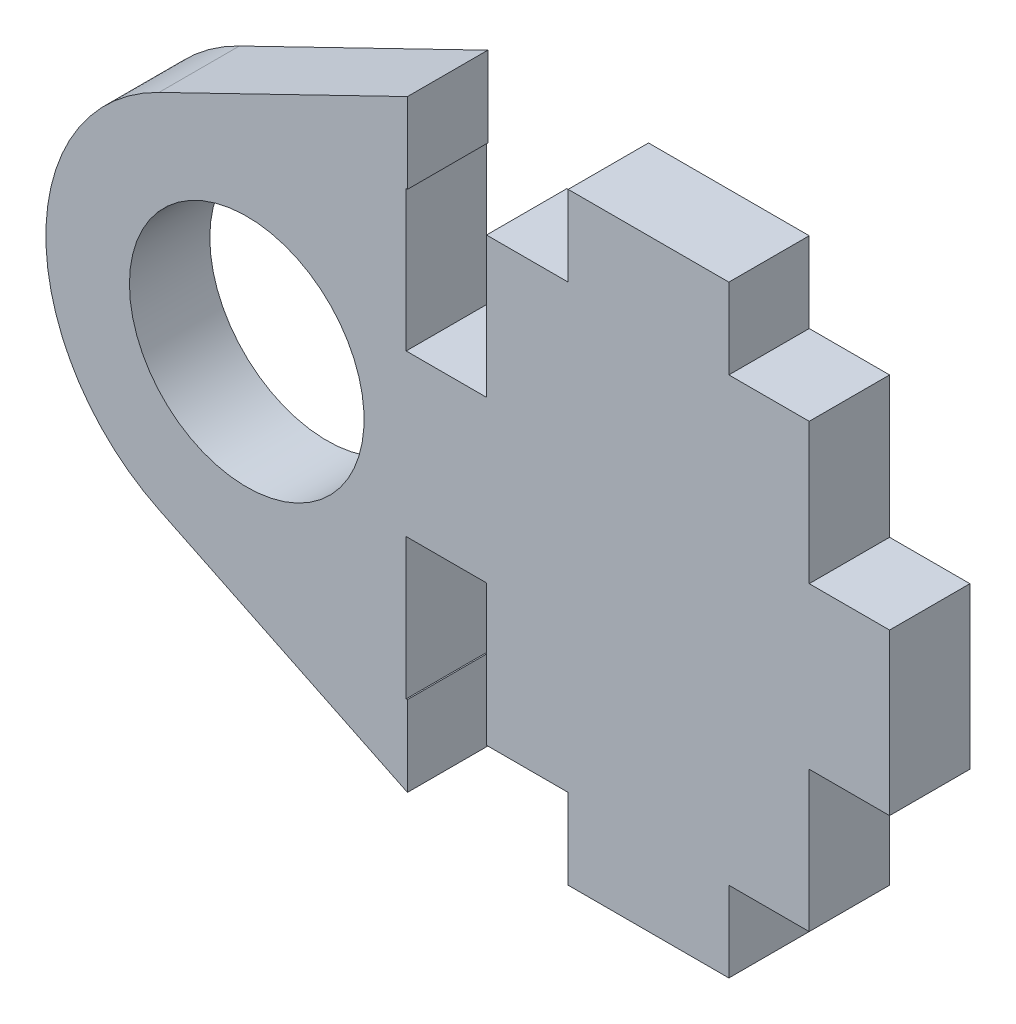
ISO-10303-21;
HEADER;
FILE_DESCRIPTION(('STEP AP214'),'2;1');
FILE_NAME('part.step','',(''),(''),'','','');
FILE_SCHEMA(('AUTOMOTIVE_DESIGN { 1 0 10303 214 1 1 1 1 }'));
ENDSEC;
DATA;
#1=APPLICATION_CONTEXT('core data for automotive mechanical design processes');
#2=APPLICATION_PROTOCOL_DEFINITION('international standard','automotive_design',2000,#1);
#3=PRODUCT_CONTEXT('',#1,'mechanical');
#4=PRODUCT('Part','Part','',(#3));
#5=PRODUCT_RELATED_PRODUCT_CATEGORY('part','',(#4));
#6=PRODUCT_DEFINITION_FORMATION('','',#4);
#7=PRODUCT_DEFINITION_CONTEXT('part definition',#1,'design');
#8=PRODUCT_DEFINITION('design','',#6,#7);
#9=PRODUCT_DEFINITION_SHAPE('','',#8);
#10=(LENGTH_UNIT() NAMED_UNIT(*) SI_UNIT(.MILLI.,.METRE.));
#11=(NAMED_UNIT(*) PLANE_ANGLE_UNIT() SI_UNIT($,.RADIAN.));
#12=(NAMED_UNIT(*) SI_UNIT($,.STERADIAN.) SOLID_ANGLE_UNIT());
#13=UNCERTAINTY_MEASURE_WITH_UNIT(LENGTH_MEASURE(1.E-05),#10,'distance_accuracy_value','');
#14=(GEOMETRIC_REPRESENTATION_CONTEXT(3) GLOBAL_UNCERTAINTY_ASSIGNED_CONTEXT((#13)) GLOBAL_UNIT_ASSIGNED_CONTEXT((#10,
#11,#12)) REPRESENTATION_CONTEXT('',''));
#15=CARTESIAN_POINT('',(0.,0.,0.));
#16=DIRECTION('',(0.,0.,1.));
#17=DIRECTION('',(1.,0.,0.));
#18=AXIS2_PLACEMENT_3D('',#15,#16,#17);
#19=CARTESIAN_POINT('',(-31.75,0.,6.35));
#20=DIRECTION('',(0.,0.,1.));
#21=DIRECTION('',(1.,0.,0.));
#22=AXIS2_PLACEMENT_3D('',#19,#20,#21);
#23=PLANE('',#22);
#24=CARTESIAN_POINT('',(-31.75,0.,6.35));
#25=DIRECTION('',(0.,0.,-1.));
#26=DIRECTION('',(-1.,0.,0.));
#27=AXIS2_PLACEMENT_3D('',#24,#25,#26);
#28=CIRCLE('',#27,9.271);
#29=CARTESIAN_POINT('',(-41.021,0.,6.35));
#30=VERTEX_POINT('',#29);
#31=EDGE_CURVE('E243',#30,#30,#28,.T.);
#32=ORIENTED_EDGE('',*,*,#31,.T.);
#33=EDGE_LOOP('',(#32));
#34=FACE_BOUND('',#33,.T.);
#35=DIRECTION('',(1.,0.,0.));
#36=VECTOR('',#35,1.);
#37=CARTESIAN_POINT('',(6.35000000000001,-17.4625,6.35));
#38=LINE('',#37,#36);
#39=CARTESIAN_POINT('',(6.35000000000001,-17.4625,6.35));
#40=VERTEX_POINT('',#39);
#41=CARTESIAN_POINT('',(12.7,-17.4625,6.35));
#42=VERTEX_POINT('',#41);
#43=EDGE_CURVE('E379',#40,#42,#38,.T.);
#44=ORIENTED_EDGE('',*,*,#43,.T.);
#45=DIRECTION('',(0.,1.,0.));
#46=VECTOR('',#45,1.);
#47=CARTESIAN_POINT('',(12.7,-17.4625,6.35000000000005));
#48=LINE('',#47,#46);
#49=CARTESIAN_POINT('',(12.7,-6.35000000000003,6.35000000000005));
#50=VERTEX_POINT('',#49);
#51=EDGE_CURVE('E56',#42,#50,#48,.T.);
#52=ORIENTED_EDGE('',*,*,#51,.T.);
#53=DIRECTION('',(-1.,0.,0.));
#54=VECTOR('',#53,1.);
#55=CARTESIAN_POINT('',(12.7,-6.35000000000003,6.35000000000005));
#56=LINE('',#55,#54);
#57=CARTESIAN_POINT('',(19.05,-6.35000000000003,6.35000000000005));
#58=VERTEX_POINT('',#57);
#59=EDGE_CURVE('E435',#58,#50,#56,.T.);
#60=ORIENTED_EDGE('',*,*,#59,.F.);
#61=DIRECTION('',(0.,1.,0.));
#62=VECTOR('',#61,1.);
#63=CARTESIAN_POINT('',(19.05,-23.8125,6.35));
#64=LINE('',#63,#62);
#65=CARTESIAN_POINT('',(19.05,6.34999999999997,6.35000000000005));
#66=VERTEX_POINT('',#65);
#67=EDGE_CURVE('E236',#58,#66,#64,.T.);
#68=ORIENTED_EDGE('',*,*,#67,.T.);
#69=DIRECTION('',(1.,0.,0.));
#70=VECTOR('',#69,1.);
#71=CARTESIAN_POINT('',(12.7,6.34999999999997,6.35000000000005));
#72=LINE('',#71,#70);
#73=CARTESIAN_POINT('',(12.7,6.34999999999997,6.35000000000005));
#74=VERTEX_POINT('',#73);
#75=EDGE_CURVE('E227',#74,#66,#72,.T.);
#76=ORIENTED_EDGE('',*,*,#75,.F.);
#77=CARTESIAN_POINT('',(12.7,17.4625,6.35000000000005));
#78=VERTEX_POINT('',#77);
#79=EDGE_CURVE('E437',#74,#78,#48,.T.);
#80=ORIENTED_EDGE('',*,*,#79,.T.);
#81=DIRECTION('',(-1.,0.,0.));
#82=VECTOR('',#81,1.);
#83=CARTESIAN_POINT('',(6.35000000000001,17.4625,6.35));
#84=LINE('',#83,#82);
#85=CARTESIAN_POINT('',(6.35000000000001,17.4625,6.35));
#86=VERTEX_POINT('',#85);
#87=EDGE_CURVE('E391',#78,#86,#84,.T.);
#88=ORIENTED_EDGE('',*,*,#87,.T.);
#89=DIRECTION('',(0.,1.,0.));
#90=VECTOR('',#89,1.);
#91=CARTESIAN_POINT('',(6.35000000000001,17.4625,6.35));
#92=LINE('',#91,#90);
#93=CARTESIAN_POINT('',(6.35000000000001,23.8125,6.35));
#94=VERTEX_POINT('',#93);
#95=EDGE_CURVE('E393',#86,#94,#92,.T.);
#96=ORIENTED_EDGE('',*,*,#95,.T.);
#97=DIRECTION('',(-1.,0.,0.));
#98=VECTOR('',#97,1.);
#99=CARTESIAN_POINT('',(-19.05,23.8125,6.35));
#100=LINE('',#99,#98);
#101=CARTESIAN_POINT('',(-6.34999999999998,23.8125,6.35));
#102=VERTEX_POINT('',#101);
#103=EDGE_CURVE('E408',#94,#102,#100,.T.);
#104=ORIENTED_EDGE('',*,*,#103,.T.);
#105=DIRECTION('',(0.,-1.,0.));
#106=VECTOR('',#105,1.);
#107=CARTESIAN_POINT('',(-6.34999999999998,17.4625,6.35));
#108=LINE('',#107,#106);
#109=CARTESIAN_POINT('',(-6.34999999999998,17.4625,6.35));
#110=VERTEX_POINT('',#109);
#111=EDGE_CURVE('E356',#102,#110,#108,.T.);
#112=ORIENTED_EDGE('',*,*,#111,.T.);
#113=DIRECTION('',(-1.,0.,0.));
#114=VECTOR('',#113,1.);
#115=CARTESIAN_POINT('',(-19.05,17.4625,6.35));
#116=LINE('',#115,#114);
#117=CARTESIAN_POINT('',(-12.8016,17.4625,6.35));
#118=VERTEX_POINT('',#117);
#119=EDGE_CURVE('E359',#110,#118,#116,.T.);
#120=ORIENTED_EDGE('',*,*,#119,.T.);
#121=DIRECTION('',(0.,1.,0.));
#122=VECTOR('',#121,1.);
#123=CARTESIAN_POINT('',(-12.8016,-17.4625,6.34999999999999));
#124=LINE('',#123,#122);
#125=CARTESIAN_POINT('',(-12.8016,6.34999999999997,6.34999999999999));
#126=VERTEX_POINT('',#125);
#127=EDGE_CURVE('E308',#126,#118,#124,.T.);
#128=ORIENTED_EDGE('',*,*,#127,.F.);
#129=DIRECTION('',(1.,0.,0.));
#130=VECTOR('',#129,1.);
#131=CARTESIAN_POINT('',(-19.1516,6.34999999999997,6.34999999999999));
#132=LINE('',#131,#130);
#133=CARTESIAN_POINT('',(-19.1516,6.34999999999997,6.34999999999999));
#134=VERTEX_POINT('',#133);
#135=EDGE_CURVE('E458',#134,#126,#132,.T.);
#136=ORIENTED_EDGE('',*,*,#135,.F.);
#137=DIRECTION('',(0.,1.,0.));
#138=VECTOR('',#137,1.);
#139=CARTESIAN_POINT('',(-19.1516,-17.4625,6.34999999999999));
#140=LINE('',#139,#138);
#141=CARTESIAN_POINT('',(-19.1516,17.4625,6.34999999999999));
#142=VERTEX_POINT('',#141);
#143=EDGE_CURVE('E318',#134,#142,#140,.T.);
#144=ORIENTED_EDGE('',*,*,#143,.T.);
#145=DIRECTION('',(1.,0.,0.));
#146=VECTOR('',#145,1.);
#147=CARTESIAN_POINT('',(-19.1516,17.4625,6.34999999999999));
#148=LINE('',#147,#146);
#149=CARTESIAN_POINT('',(-19.05,17.4625,6.34999999999999));
#150=VERTEX_POINT('',#149);
#151=EDGE_CURVE('E300',#142,#150,#148,.T.);
#152=ORIENTED_EDGE('',*,*,#151,.T.);
#153=DIRECTION('',(0.,1.,0.));
#154=VECTOR('',#153,1.);
#155=CARTESIAN_POINT('',(-19.05,17.4625,6.35));
#156=LINE('',#155,#154);
#157=CARTESIAN_POINT('',(-19.05,23.8125,6.35));
#158=VERTEX_POINT('',#157);
#159=EDGE_CURVE('E362',#150,#158,#156,.T.);
#160=ORIENTED_EDGE('',*,*,#159,.T.);
#161=DIRECTION('',(-0.899591061172804,-0.436733239699006,0.));
#162=VECTOR('',#161,1.);
#163=CARTESIAN_POINT('',(-19.05,23.8125,6.35));
#164=LINE('',#163,#162);
#165=CARTESIAN_POINT('',(-38.6831401802217,14.2810080961183,6.35));
#166=VERTEX_POINT('',#165);
#167=EDGE_CURVE('E411',#158,#166,#164,.T.);
#168=ORIENTED_EDGE('',*,*,#167,.T.);
#169=CARTESIAN_POINT('',(-31.75,0.,6.35));
#170=DIRECTION('',(0.,0.,1.));
#171=DIRECTION('',(1.,0.,0.));
#172=AXIS2_PLACEMENT_3D('',#169,#170,#171);
#173=CIRCLE('',#172,15.875);
#174=CARTESIAN_POINT('',(-38.6831401802217,-14.2810080961183,6.35));
#175=VERTEX_POINT('',#174);
#176=EDGE_CURVE('E413',#166,#175,#173,.T.);
#177=ORIENTED_EDGE('',*,*,#176,.T.);
#178=DIRECTION('',(0.899591061172804,-0.436733239699006,0.));
#179=VECTOR('',#178,1.);
#180=CARTESIAN_POINT('',(-19.05,-23.8125,6.35));
#181=LINE('',#180,#179);
#182=CARTESIAN_POINT('',(-19.05,-23.8125,6.35));
#183=VERTEX_POINT('',#182);
#184=EDGE_CURVE('E414',#175,#183,#181,.T.);
#185=ORIENTED_EDGE('',*,*,#184,.T.);
#186=DIRECTION('',(0.,1.,0.));
#187=VECTOR('',#186,1.);
#188=CARTESIAN_POINT('',(-19.05,-30.1625,6.35));
#189=LINE('',#188,#187);
#190=CARTESIAN_POINT('',(-19.05,-17.4625,6.34999999999999));
#191=VERTEX_POINT('',#190);
#192=EDGE_CURVE('E338',#183,#191,#189,.T.);
#193=ORIENTED_EDGE('',*,*,#192,.T.);
#194=DIRECTION('',(1.,0.,0.));
#195=VECTOR('',#194,1.);
#196=CARTESIAN_POINT('',(-19.1516,-17.4625,6.34999999999999));
#197=LINE('',#196,#195);
#198=CARTESIAN_POINT('',(-19.1516,-17.4625,6.34999999999999));
#199=VERTEX_POINT('',#198);
#200=EDGE_CURVE('E320',#199,#191,#197,.T.);
#201=ORIENTED_EDGE('',*,*,#200,.F.);
#202=CARTESIAN_POINT('',(-19.1516,-6.35000000000003,6.34999999999999));
#203=VERTEX_POINT('',#202);
#204=EDGE_CURVE('E303',#199,#203,#140,.T.);
#205=ORIENTED_EDGE('',*,*,#204,.T.);
#206=DIRECTION('',(-1.,0.,0.));
#207=VECTOR('',#206,1.);
#208=CARTESIAN_POINT('',(-19.1516,-6.35000000000003,6.34999999999999));
#209=LINE('',#208,#207);
#210=CARTESIAN_POINT('',(-12.8016,-6.35000000000003,6.34999999999999));
#211=VERTEX_POINT('',#210);
#212=EDGE_CURVE('E313',#211,#203,#209,.T.);
#213=ORIENTED_EDGE('',*,*,#212,.F.);
#214=CARTESIAN_POINT('',(-12.8016,-17.4625,6.34999999999999));
#215=VERTEX_POINT('',#214);
#216=EDGE_CURVE('E311',#215,#211,#124,.T.);
#217=ORIENTED_EDGE('',*,*,#216,.F.);
#218=DIRECTION('',(1.,0.,0.));
#219=VECTOR('',#218,1.);
#220=CARTESIAN_POINT('',(-19.05,-17.4625,6.35));
#221=LINE('',#220,#219);
#222=CARTESIAN_POINT('',(-6.34999999999998,-17.4625,6.35));
#223=VERTEX_POINT('',#222);
#224=EDGE_CURVE('E342',#215,#223,#221,.T.);
#225=ORIENTED_EDGE('',*,*,#224,.T.);
#226=DIRECTION('',(0.,-1.,0.));
#227=VECTOR('',#226,1.);
#228=CARTESIAN_POINT('',(-6.34999999999998,-30.1625,6.35));
#229=LINE('',#228,#227);
#230=CARTESIAN_POINT('',(-6.34999999999998,-23.8125,6.35));
#231=VERTEX_POINT('',#230);
#232=EDGE_CURVE('E335',#223,#231,#229,.T.);
#233=ORIENTED_EDGE('',*,*,#232,.T.);
#234=DIRECTION('',(1.,0.,0.));
#235=VECTOR('',#234,1.);
#236=CARTESIAN_POINT('',(-19.05,-23.8125,6.35));
#237=LINE('',#236,#235);
#238=CARTESIAN_POINT('',(6.35000000000001,-23.8125,6.35));
#239=VERTEX_POINT('',#238);
#240=EDGE_CURVE('E252',#231,#239,#237,.T.);
#241=ORIENTED_EDGE('',*,*,#240,.T.);
#242=DIRECTION('',(0.,1.,0.));
#243=VECTOR('',#242,1.);
#244=CARTESIAN_POINT('',(6.35000000000001,-30.1625,6.35));
#245=LINE('',#244,#243);
#246=EDGE_CURVE('E376',#239,#40,#245,.T.);
#247=ORIENTED_EDGE('',*,*,#246,.T.);
#248=EDGE_LOOP('',(#44,#52,#60,#68,#76,#80,#88,#96,#104,#112,#120,#128,#136,#144,#152,#160,#168,
#177,#185,#193,#201,#205,#213,#217,#225,#233,#241,#247));
#249=FACE_BOUND('',#248,.T.);
#250=ADVANCED_FACE('F33',(#34,#249),#23,.T.);
#251=CARTESIAN_POINT('',(-31.75,0.,0.));
#252=DIRECTION('',(0.,0.,1.));
#253=DIRECTION('',(1.,0.,0.));
#254=AXIS2_PLACEMENT_3D('',#251,#252,#253);
#255=PLANE('',#254);
#256=DIRECTION('',(-1.,0.,0.));
#257=VECTOR('',#256,1.);
#258=CARTESIAN_POINT('',(19.05,-6.35000000000003,0.));
#259=LINE('',#258,#257);
#260=CARTESIAN_POINT('',(19.05,-6.35000000000003,0.));
#261=VERTEX_POINT('',#260);
#262=CARTESIAN_POINT('',(12.7,-6.35000000000003,0.));
#263=VERTEX_POINT('',#262);
#264=EDGE_CURVE('E217',#261,#263,#259,.T.);
#265=ORIENTED_EDGE('',*,*,#264,.T.);
#266=DIRECTION('',(0.,1.,0.));
#267=VECTOR('',#266,1.);
#268=CARTESIAN_POINT('',(12.7,0.,0.));
#269=LINE('',#268,#267);
#270=CARTESIAN_POINT('',(12.7,-17.4625,0.));
#271=VERTEX_POINT('',#270);
#272=EDGE_CURVE('E448',#271,#263,#269,.T.);
#273=ORIENTED_EDGE('',*,*,#272,.F.);
#274=DIRECTION('',(1.,0.,0.));
#275=VECTOR('',#274,1.);
#276=CARTESIAN_POINT('',(6.35000000000001,-17.4625,0.));
#277=LINE('',#276,#275);
#278=CARTESIAN_POINT('',(6.35000000000001,-17.4625,0.));
#279=VERTEX_POINT('',#278);
#280=EDGE_CURVE('E375',#279,#271,#277,.T.);
#281=ORIENTED_EDGE('',*,*,#280,.F.);
#282=DIRECTION('',(0.,-1.,0.));
#283=VECTOR('',#282,1.);
#284=CARTESIAN_POINT('',(6.35000000000002,0.,0.));
#285=LINE('',#284,#283);
#286=CARTESIAN_POINT('',(6.35,-23.8125,0.));
#287=VERTEX_POINT('',#286);
#288=EDGE_CURVE('E274',#279,#287,#285,.T.);
#289=ORIENTED_EDGE('',*,*,#288,.T.);
#290=DIRECTION('',(1.,0.,0.));
#291=VECTOR('',#290,1.);
#292=CARTESIAN_POINT('',(-19.05,-23.8125,0.));
#293=LINE('',#292,#291);
#294=CARTESIAN_POINT('',(-6.34999999999998,-23.8125,0.));
#295=VERTEX_POINT('',#294);
#296=EDGE_CURVE('E260',#295,#287,#293,.T.);
#297=ORIENTED_EDGE('',*,*,#296,.F.);
#298=DIRECTION('',(0.,-1.,0.));
#299=VECTOR('',#298,1.);
#300=CARTESIAN_POINT('',(-6.34999999999998,-30.1625,0.));
#301=LINE('',#300,#299);
#302=CARTESIAN_POINT('',(-6.34999999999998,-17.4625,0.));
#303=VERTEX_POINT('',#302);
#304=EDGE_CURVE('E345',#303,#295,#301,.T.);
#305=ORIENTED_EDGE('',*,*,#304,.F.);
#306=DIRECTION('',(1.,0.,0.));
#307=VECTOR('',#306,1.);
#308=CARTESIAN_POINT('',(-19.05,-17.4625,0.));
#309=LINE('',#308,#307);
#310=CARTESIAN_POINT('',(-12.8016,-17.4625,0.));
#311=VERTEX_POINT('',#310);
#312=EDGE_CURVE('E339',#311,#303,#309,.T.);
#313=ORIENTED_EDGE('',*,*,#312,.F.);
#314=DIRECTION('',(0.,1.,0.));
#315=VECTOR('',#314,1.);
#316=CARTESIAN_POINT('',(-12.8016,0.,0.));
#317=LINE('',#316,#315);
#318=CARTESIAN_POINT('',(-12.8016,-6.35000000000003,0.));
#319=VERTEX_POINT('',#318);
#320=EDGE_CURVE('E334',#311,#319,#317,.T.);
#321=ORIENTED_EDGE('',*,*,#320,.T.);
#322=DIRECTION('',(-1.,0.,0.));
#323=VECTOR('',#322,1.);
#324=CARTESIAN_POINT('',(-12.8016,-6.35000000000003,0.));
#325=LINE('',#324,#323);
#326=CARTESIAN_POINT('',(-19.1516,-6.35000000000003,0.));
#327=VERTEX_POINT('',#326);
#328=EDGE_CURVE('E455',#319,#327,#325,.T.);
#329=ORIENTED_EDGE('',*,*,#328,.T.);
#330=DIRECTION('',(0.,1.,0.));
#331=VECTOR('',#330,1.);
#332=CARTESIAN_POINT('',(-19.1516,0.,0.));
#333=LINE('',#332,#331);
#334=CARTESIAN_POINT('',(-19.1516,-17.4625,0.));
#335=VERTEX_POINT('',#334);
#336=EDGE_CURVE('E11',#335,#327,#333,.T.);
#337=ORIENTED_EDGE('',*,*,#336,.F.);
#338=DIRECTION('',(1.,0.,0.));
#339=VECTOR('',#338,1.);
#340=CARTESIAN_POINT('',(-19.1516,-17.4625,0.));
#341=LINE('',#340,#339);
#342=CARTESIAN_POINT('',(-19.05,-17.4625,0.));
#343=VERTEX_POINT('',#342);
#344=EDGE_CURVE('E309',#335,#343,#341,.T.);
#345=ORIENTED_EDGE('',*,*,#344,.T.);
#346=DIRECTION('',(0.,-1.,0.));
#347=VECTOR('',#346,1.);
#348=CARTESIAN_POINT('',(-19.05,0.,0.));
#349=LINE('',#348,#347);
#350=CARTESIAN_POINT('',(-19.05,-23.8125,0.));
#351=VERTEX_POINT('',#350);
#352=EDGE_CURVE('E279',#343,#351,#349,.T.);
#353=ORIENTED_EDGE('',*,*,#352,.T.);
#354=DIRECTION('',(0.899591061172804,-0.436733239699006,0.));
#355=VECTOR('',#354,1.);
#356=CARTESIAN_POINT('',(-19.05,-23.8125,0.));
#357=LINE('',#356,#355);
#358=CARTESIAN_POINT('',(-38.6831401802217,-14.2810080961183,0.));
#359=VERTEX_POINT('',#358);
#360=EDGE_CURVE('E258',#359,#351,#357,.T.);
#361=ORIENTED_EDGE('',*,*,#360,.F.);
#362=CARTESIAN_POINT('',(-31.75,0.,0.));
#363=DIRECTION('',(0.,0.,1.));
#364=DIRECTION('',(1.,0.,0.));
#365=AXIS2_PLACEMENT_3D('',#362,#363,#364);
#366=CIRCLE('',#365,15.875);
#367=CARTESIAN_POINT('',(-38.6831401802217,14.2810080961183,0.));
#368=VERTEX_POINT('',#367);
#369=EDGE_CURVE('E256',#368,#359,#366,.T.);
#370=ORIENTED_EDGE('',*,*,#369,.F.);
#371=DIRECTION('',(-0.899591061172804,-0.436733239699006,0.));
#372=VECTOR('',#371,1.);
#373=CARTESIAN_POINT('',(-19.05,23.8125,0.));
#374=LINE('',#373,#372);
#375=CARTESIAN_POINT('',(-19.05,23.8125,0.));
#376=VERTEX_POINT('',#375);
#377=EDGE_CURVE('E246',#376,#368,#374,.T.);
#378=ORIENTED_EDGE('',*,*,#377,.F.);
#379=DIRECTION('',(0.,1.,0.));
#380=VECTOR('',#379,1.);
#381=CARTESIAN_POINT('',(-19.05,17.4625,0.));
#382=LINE('',#381,#380);
#383=CARTESIAN_POINT('',(-19.05,17.4625,0.));
#384=VERTEX_POINT('',#383);
#385=EDGE_CURVE('E307',#384,#376,#382,.T.);
#386=ORIENTED_EDGE('',*,*,#385,.F.);
#387=DIRECTION('',(-1.,0.,0.));
#388=VECTOR('',#387,1.);
#389=CARTESIAN_POINT('',(-19.1516,17.4625,0.));
#390=LINE('',#389,#388);
#391=CARTESIAN_POINT('',(-19.1516,17.4625,0.));
#392=VERTEX_POINT('',#391);
#393=EDGE_CURVE('E297',#384,#392,#390,.T.);
#394=ORIENTED_EDGE('',*,*,#393,.T.);
#395=CARTESIAN_POINT('',(-19.1516,6.34999999999997,0.));
#396=VERTEX_POINT('',#395);
#397=EDGE_CURVE('E37',#396,#392,#333,.T.);
#398=ORIENTED_EDGE('',*,*,#397,.F.);
#399=DIRECTION('',(-1.,0.,0.));
#400=VECTOR('',#399,1.);
#401=CARTESIAN_POINT('',(-12.8016,6.34999999999997,0.));
#402=LINE('',#401,#400);
#403=CARTESIAN_POINT('',(-12.8016,6.34999999999997,0.));
#404=VERTEX_POINT('',#403);
#405=EDGE_CURVE('E451',#404,#396,#402,.T.);
#406=ORIENTED_EDGE('',*,*,#405,.F.);
#407=CARTESIAN_POINT('',(-12.8016,17.4625,0.));
#408=VERTEX_POINT('',#407);
#409=EDGE_CURVE('E331',#404,#408,#317,.T.);
#410=ORIENTED_EDGE('',*,*,#409,.T.);
#411=DIRECTION('',(-1.,0.,0.));
#412=VECTOR('',#411,1.);
#413=CARTESIAN_POINT('',(-19.05,17.4625,0.));
#414=LINE('',#413,#412);
#415=CARTESIAN_POINT('',(-6.34999999999999,17.4625,0.));
#416=VERTEX_POINT('',#415);
#417=EDGE_CURVE('E355',#416,#408,#414,.T.);
#418=ORIENTED_EDGE('',*,*,#417,.F.);
#419=DIRECTION('',(0.,1.,0.));
#420=VECTOR('',#419,1.);
#421=CARTESIAN_POINT('',(-6.34999999999999,0.,0.));
#422=LINE('',#421,#420);
#423=CARTESIAN_POINT('',(-6.34999999999998,23.8125,0.));
#424=VERTEX_POINT('',#423);
#425=EDGE_CURVE('E277',#416,#424,#422,.T.);
#426=ORIENTED_EDGE('',*,*,#425,.T.);
#427=DIRECTION('',(-1.,0.,0.));
#428=VECTOR('',#427,1.);
#429=CARTESIAN_POINT('',(-19.05,23.8125,0.));
#430=LINE('',#429,#428);
#431=CARTESIAN_POINT('',(6.35000000000001,23.8125,0.));
#432=VERTEX_POINT('',#431);
#433=EDGE_CURVE('E242',#432,#424,#430,.T.);
#434=ORIENTED_EDGE('',*,*,#433,.F.);
#435=DIRECTION('',(0.,1.,0.));
#436=VECTOR('',#435,1.);
#437=CARTESIAN_POINT('',(6.35000000000001,17.4625,0.));
#438=LINE('',#437,#436);
#439=CARTESIAN_POINT('',(6.35000000000001,17.4625,0.));
#440=VERTEX_POINT('',#439);
#441=EDGE_CURVE('E394',#440,#432,#438,.T.);
#442=ORIENTED_EDGE('',*,*,#441,.F.);
#443=DIRECTION('',(-1.,0.,0.));
#444=VECTOR('',#443,1.);
#445=CARTESIAN_POINT('',(6.35000000000001,17.4625,0.));
#446=LINE('',#445,#444);
#447=CARTESIAN_POINT('',(12.7,17.4625,0.));
#448=VERTEX_POINT('',#447);
#449=EDGE_CURVE('E390',#448,#440,#446,.T.);
#450=ORIENTED_EDGE('',*,*,#449,.F.);
#451=CARTESIAN_POINT('',(12.7,6.34999999999997,0.));
#452=VERTEX_POINT('',#451);
#453=EDGE_CURVE('E48',#452,#448,#269,.T.);
#454=ORIENTED_EDGE('',*,*,#453,.F.);
#455=DIRECTION('',(-1.,0.,0.));
#456=VECTOR('',#455,1.);
#457=CARTESIAN_POINT('',(19.05,6.34999999999997,0.));
#458=LINE('',#457,#456);
#459=CARTESIAN_POINT('',(19.05,6.34999999999997,0.));
#460=VERTEX_POINT('',#459);
#461=EDGE_CURVE('E228',#460,#452,#458,.T.);
#462=ORIENTED_EDGE('',*,*,#461,.F.);
#463=DIRECTION('',(0.,1.,0.));
#464=VECTOR('',#463,1.);
#465=CARTESIAN_POINT('',(19.05,-23.8125,0.));
#466=LINE('',#465,#464);
#467=EDGE_CURVE('E234',#261,#460,#466,.T.);
#468=ORIENTED_EDGE('',*,*,#467,.F.);
#469=EDGE_LOOP('',(#265,#273,#281,#289,#297,#305,#313,#321,#329,#337,#345,#353,#361,#370,#378,
#386,#394,#398,#406,#410,#418,#426,#434,#442,#450,#454,#462,#468));
#470=FACE_BOUND('',#469,.T.);
#471=CARTESIAN_POINT('',(-31.75,0.,0.));
#472=DIRECTION('',(0.,0.,-1.));
#473=DIRECTION('',(-1.,0.,0.));
#474=AXIS2_PLACEMENT_3D('',#471,#472,#473);
#475=CIRCLE('',#474,9.271);
#476=CARTESIAN_POINT('',(-41.021,0.,0.));
#477=VERTEX_POINT('',#476);
#478=EDGE_CURVE('E249',#477,#477,#475,.T.);
#479=ORIENTED_EDGE('',*,*,#478,.F.);
#480=EDGE_LOOP('',(#479));
#481=FACE_BOUND('',#480,.T.);
#482=ADVANCED_FACE('F239',(#470,#481),#255,.F.);
#483=CARTESIAN_POINT('',(19.05,-23.8125,6.35));
#484=DIRECTION('',(-1.,0.,0.));
#485=DIRECTION('',(0.,-1.,0.));
#486=AXIS2_PLACEMENT_3D('',#483,#484,#485);
#487=PLANE('',#486);
#488=DIRECTION('',(0.,0.,1.));
#489=VECTOR('',#488,1.);
#490=CARTESIAN_POINT('',(19.05,-6.35000000000003,0.));
#491=LINE('',#490,#489);
#492=EDGE_CURVE('E221',#261,#58,#491,.T.);
#493=ORIENTED_EDGE('',*,*,#492,.F.);
#494=ORIENTED_EDGE('',*,*,#467,.T.);
#495=DIRECTION('',(0.,0.,1.));
#496=VECTOR('',#495,1.);
#497=CARTESIAN_POINT('',(19.05,6.34999999999997,-53.9749999999999));
#498=LINE('',#497,#496);
#499=EDGE_CURVE('E445',#460,#66,#498,.T.);
#500=ORIENTED_EDGE('',*,*,#499,.T.);
#501=ORIENTED_EDGE('',*,*,#67,.F.);
#502=EDGE_LOOP('',(#493,#494,#500,#501));
#503=FACE_BOUND('',#502,.T.);
#504=ADVANCED_FACE('F35',(#503),#487,.F.);
#505=CARTESIAN_POINT('',(6.35000000000001,17.4625,6.35));
#506=DIRECTION('',(0.,-1.,0.));
#507=DIRECTION('',(1.,0.,0.));
#508=AXIS2_PLACEMENT_3D('',#505,#506,#507);
#509=PLANE('',#508);
#510=DIRECTION('',(0.,0.,-1.));
#511=VECTOR('',#510,1.);
#512=CARTESIAN_POINT('',(12.7,17.4625,-114.3));
#513=LINE('',#512,#511);
#514=EDGE_CURVE('E436',#78,#448,#513,.T.);
#515=ORIENTED_EDGE('',*,*,#514,.T.);
#516=ORIENTED_EDGE('',*,*,#449,.T.);
#517=DIRECTION('',(0.,0.,-1.));
#518=VECTOR('',#517,1.);
#519=CARTESIAN_POINT('',(6.35000000000001,17.4625,6.35));
#520=LINE('',#519,#518);
#521=EDGE_CURVE('E397',#86,#440,#520,.T.);
#522=ORIENTED_EDGE('',*,*,#521,.F.);
#523=ORIENTED_EDGE('',*,*,#87,.F.);
#524=EDGE_LOOP('',(#515,#516,#522,#523));
#525=FACE_BOUND('',#524,.T.);
#526=ADVANCED_FACE('F528',(#525),#509,.F.);
#527=CARTESIAN_POINT('',(6.35000000000001,-17.4625,6.35));
#528=DIRECTION('',(0.,1.,0.));
#529=DIRECTION('',(-1.,0.,0.));
#530=AXIS2_PLACEMENT_3D('',#527,#528,#529);
#531=PLANE('',#530);
#532=DIRECTION('',(0.,0.,1.));
#533=VECTOR('',#532,1.);
#534=CARTESIAN_POINT('',(12.7,-17.4625,-114.3));
#535=LINE('',#534,#533);
#536=EDGE_CURVE('E434',#271,#42,#535,.T.);
#537=ORIENTED_EDGE('',*,*,#536,.T.);
#538=ORIENTED_EDGE('',*,*,#43,.F.);
#539=DIRECTION('',(0.,0.,-1.));
#540=VECTOR('',#539,1.);
#541=CARTESIAN_POINT('',(6.35000000000001,-17.4625,6.35));
#542=LINE('',#541,#540);
#543=EDGE_CURVE('E382',#40,#279,#542,.T.);
#544=ORIENTED_EDGE('',*,*,#543,.T.);
#545=ORIENTED_EDGE('',*,*,#280,.T.);
#546=EDGE_LOOP('',(#537,#538,#544,#545));
#547=FACE_BOUND('',#546,.T.);
#548=ADVANCED_FACE('F433',(#547),#531,.F.);
#549=CARTESIAN_POINT('',(-19.05,23.8125,6.35));
#550=DIRECTION('',(0.,-1.,0.));
#551=DIRECTION('',(0.,0.,-1.));
#552=AXIS2_PLACEMENT_3D('',#549,#550,#551);
#553=PLANE('',#552);
#554=ORIENTED_EDGE('',*,*,#433,.T.);
#555=DIRECTION('',(0.,0.,1.));
#556=VECTOR('',#555,1.);
#557=CARTESIAN_POINT('',(-6.34999999999998,23.8125,6.35));
#558=LINE('',#557,#556);
#559=EDGE_CURVE('E371',#424,#102,#558,.T.);
#560=ORIENTED_EDGE('',*,*,#559,.T.);
#561=ORIENTED_EDGE('',*,*,#103,.F.);
#562=DIRECTION('',(0.,0.,-1.));
#563=VECTOR('',#562,1.);
#564=CARTESIAN_POINT('',(6.35000000000002,23.8125,6.35));
#565=LINE('',#564,#563);
#566=EDGE_CURVE('E402',#94,#432,#565,.T.);
#567=ORIENTED_EDGE('',*,*,#566,.T.);
#568=EDGE_LOOP('',(#554,#560,#561,#567));
#569=FACE_BOUND('',#568,.T.);
#570=ADVANCED_FACE('F521',(#569),#553,.F.);
#571=CARTESIAN_POINT('',(-19.05,23.8125,6.35));
#572=DIRECTION('',(0.436733239699006,-0.899591061172803,0.));
#573=DIRECTION('',(0.899591061172803,0.436733239699006,0.));
#574=AXIS2_PLACEMENT_3D('',#571,#572,#573);
#575=PLANE('',#574);
#576=ORIENTED_EDGE('',*,*,#377,.T.);
#577=DIRECTION('',(0.,0.,-1.));
#578=VECTOR('',#577,1.);
#579=CARTESIAN_POINT('',(-38.6831401802217,14.2810080961183,6.35));
#580=LINE('',#579,#578);
#581=EDGE_CURVE('E268',#166,#368,#580,.T.);
#582=ORIENTED_EDGE('',*,*,#581,.F.);
#583=ORIENTED_EDGE('',*,*,#167,.F.);
#584=DIRECTION('',(0.,0.,-1.));
#585=VECTOR('',#584,1.);
#586=CARTESIAN_POINT('',(-19.05,23.8125,6.35));
#587=LINE('',#586,#585);
#588=EDGE_CURVE('E271',#158,#376,#587,.T.);
#589=ORIENTED_EDGE('',*,*,#588,.T.);
#590=EDGE_LOOP('',(#576,#582,#583,#589));
#591=FACE_BOUND('',#590,.T.);
#592=ADVANCED_FACE('F518',(#591),#575,.F.);
#593=CARTESIAN_POINT('',(-31.75,0.,6.35));
#594=DIRECTION('',(0.,0.,-1.));
#595=DIRECTION('',(-1.,0.,0.));
#596=AXIS2_PLACEMENT_3D('',#593,#594,#595);
#597=CYLINDRICAL_SURFACE('',#596,15.875);
#598=ORIENTED_EDGE('',*,*,#369,.T.);
#599=DIRECTION('',(0.,0.,-1.));
#600=VECTOR('',#599,1.);
#601=CARTESIAN_POINT('',(-38.6831401802217,-14.2810080961183,6.35));
#602=LINE('',#601,#600);
#603=EDGE_CURVE('E265',#175,#359,#602,.T.);
#604=ORIENTED_EDGE('',*,*,#603,.F.);
#605=ORIENTED_EDGE('',*,*,#176,.F.);
#606=ORIENTED_EDGE('',*,*,#581,.T.);
#607=EDGE_LOOP('',(#598,#604,#605,#606));
#608=FACE_BOUND('',#607,.T.);
#609=ADVANCED_FACE('F514',(#608),#597,.T.);
#610=CARTESIAN_POINT('',(-19.05,-23.8125,6.35));
#611=DIRECTION('',(0.436733239699006,0.899591061172804,0.));
#612=DIRECTION('',(-0.899591061172804,0.436733239699006,0.));
#613=AXIS2_PLACEMENT_3D('',#610,#611,#612);
#614=PLANE('',#613);
#615=ORIENTED_EDGE('',*,*,#360,.T.);
#616=DIRECTION('',(0.,0.,-1.));
#617=VECTOR('',#616,1.);
#618=CARTESIAN_POINT('',(-19.05,-23.8125,6.35));
#619=LINE('',#618,#617);
#620=EDGE_CURVE('E262',#183,#351,#619,.T.);
#621=ORIENTED_EDGE('',*,*,#620,.F.);
#622=ORIENTED_EDGE('',*,*,#184,.F.);
#623=ORIENTED_EDGE('',*,*,#603,.T.);
#624=EDGE_LOOP('',(#615,#621,#622,#623));
#625=FACE_BOUND('',#624,.T.);
#626=ADVANCED_FACE('F511',(#625),#614,.F.);
#627=CARTESIAN_POINT('',(-19.05,-23.8125,6.35));
#628=DIRECTION('',(0.,1.,0.));
#629=DIRECTION('',(-1.,0.,0.));
#630=AXIS2_PLACEMENT_3D('',#627,#628,#629);
#631=PLANE('',#630);
#632=ORIENTED_EDGE('',*,*,#240,.F.);
#633=DIRECTION('',(0.,0.,-1.));
#634=VECTOR('',#633,1.);
#635=CARTESIAN_POINT('',(-6.34999999999998,-23.8125,6.35));
#636=LINE('',#635,#634);
#637=EDGE_CURVE('E351',#231,#295,#636,.T.);
#638=ORIENTED_EDGE('',*,*,#637,.T.);
#639=ORIENTED_EDGE('',*,*,#296,.T.);
#640=DIRECTION('',(0.,0.,1.));
#641=VECTOR('',#640,1.);
#642=CARTESIAN_POINT('',(6.35000000000001,-23.8125,6.35));
#643=LINE('',#642,#641);
#644=EDGE_CURVE('E387',#287,#239,#643,.T.);
#645=ORIENTED_EDGE('',*,*,#644,.T.);
#646=EDGE_LOOP('',(#632,#638,#639,#645));
#647=FACE_BOUND('',#646,.T.);
#648=ADVANCED_FACE('F427',(#647),#631,.F.);
#649=CARTESIAN_POINT('',(-31.75,0.,6.35));
#650=DIRECTION('',(0.,0.,-1.));
#651=DIRECTION('',(-1.,0.,0.));
#652=AXIS2_PLACEMENT_3D('',#649,#650,#651);
#653=CYLINDRICAL_SURFACE('',#652,9.271);
#654=ORIENTED_EDGE('',*,*,#31,.F.);
#655=EDGE_LOOP('',(#654));
#656=FACE_BOUND('',#655,.T.);
#657=ORIENTED_EDGE('',*,*,#478,.T.);
#658=EDGE_LOOP('',(#657));
#659=FACE_BOUND('',#658,.T.);
#660=ADVANCED_FACE('F506',(#656,#659),#653,.F.);
#661=CARTESIAN_POINT('',(6.35000000000001,17.4625,6.35));
#662=DIRECTION('',(-1.,0.,0.));
#663=DIRECTION('',(0.,-1.,0.));
#664=AXIS2_PLACEMENT_3D('',#661,#662,#663);
#665=PLANE('',#664);
#666=ORIENTED_EDGE('',*,*,#95,.F.);
#667=ORIENTED_EDGE('',*,*,#521,.T.);
#668=ORIENTED_EDGE('',*,*,#441,.T.);
#669=ORIENTED_EDGE('',*,*,#566,.F.);
#670=EDGE_LOOP('',(#666,#667,#668,#669));
#671=FACE_BOUND('',#670,.T.);
#672=ADVANCED_FACE('F544',(#671),#665,.F.);
#673=CARTESIAN_POINT('',(6.35000000000001,-30.1625,6.35));
#674=DIRECTION('',(-1.,0.,0.));
#675=DIRECTION('',(0.,-1.,0.));
#676=AXIS2_PLACEMENT_3D('',#673,#674,#675);
#677=PLANE('',#676);
#678=ORIENTED_EDGE('',*,*,#288,.F.);
#679=ORIENTED_EDGE('',*,*,#543,.F.);
#680=ORIENTED_EDGE('',*,*,#246,.F.);
#681=ORIENTED_EDGE('',*,*,#644,.F.);
#682=EDGE_LOOP('',(#678,#679,#680,#681));
#683=FACE_BOUND('',#682,.T.);
#684=ADVANCED_FACE('F425',(#683),#677,.F.);
#685=CARTESIAN_POINT('',(-6.34999999999998,17.4625,6.35));
#686=DIRECTION('',(1.,0.,0.));
#687=DIRECTION('',(0.,1.,0.));
#688=AXIS2_PLACEMENT_3D('',#685,#686,#687);
#689=PLANE('',#688);
#690=ORIENTED_EDGE('',*,*,#425,.F.);
#691=DIRECTION('',(0.,0.,-1.));
#692=VECTOR('',#691,1.);
#693=CARTESIAN_POINT('',(-6.34999999999998,17.4625,6.35));
#694=LINE('',#693,#692);
#695=EDGE_CURVE('E365',#110,#416,#694,.T.);
#696=ORIENTED_EDGE('',*,*,#695,.F.);
#697=ORIENTED_EDGE('',*,*,#111,.F.);
#698=ORIENTED_EDGE('',*,*,#559,.F.);
#699=EDGE_LOOP('',(#690,#696,#697,#698));
#700=FACE_BOUND('',#699,.T.);
#701=ADVANCED_FACE('F537',(#700),#689,.F.);
#702=CARTESIAN_POINT('',(-19.05,17.4625,6.35));
#703=DIRECTION('',(-1.,0.,0.));
#704=DIRECTION('',(0.,-1.,0.));
#705=AXIS2_PLACEMENT_3D('',#702,#703,#704);
#706=PLANE('',#705);
#707=ORIENTED_EDGE('',*,*,#159,.F.);
#708=DIRECTION('',(0.,0.,-1.));
#709=VECTOR('',#708,1.);
#710=CARTESIAN_POINT('',(-19.05,17.4625,6.35));
#711=LINE('',#710,#709);
#712=EDGE_CURVE('E369',#150,#384,#711,.T.);
#713=ORIENTED_EDGE('',*,*,#712,.T.);
#714=ORIENTED_EDGE('',*,*,#385,.T.);
#715=ORIENTED_EDGE('',*,*,#588,.F.);
#716=EDGE_LOOP('',(#707,#713,#714,#715));
#717=FACE_BOUND('',#716,.T.);
#718=ADVANCED_FACE('F494',(#717),#706,.F.);
#719=CARTESIAN_POINT('',(-19.05,17.4625,6.35));
#720=DIRECTION('',(0.,-1.,0.));
#721=DIRECTION('',(1.,0.,0.));
#722=AXIS2_PLACEMENT_3D('',#719,#720,#721);
#723=PLANE('',#722);
#724=ORIENTED_EDGE('',*,*,#417,.T.);
#725=DIRECTION('',(0.,0.,-1.));
#726=VECTOR('',#725,1.);
#727=CARTESIAN_POINT('',(-12.8016,17.4625,-114.3));
#728=LINE('',#727,#726);
#729=EDGE_CURVE('E323',#118,#408,#728,.T.);
#730=ORIENTED_EDGE('',*,*,#729,.F.);
#731=ORIENTED_EDGE('',*,*,#119,.F.);
#732=ORIENTED_EDGE('',*,*,#695,.T.);
#733=EDGE_LOOP('',(#724,#730,#731,#732));
#734=FACE_BOUND('',#733,.T.);
#735=ADVANCED_FACE('F486',(#734),#723,.F.);
#736=CARTESIAN_POINT('',(-6.34999999999998,-30.1625,6.35));
#737=DIRECTION('',(1.,0.,0.));
#738=DIRECTION('',(0.,0.,-1.));
#739=AXIS2_PLACEMENT_3D('',#736,#737,#738);
#740=PLANE('',#739);
#741=ORIENTED_EDGE('',*,*,#232,.F.);
#742=DIRECTION('',(0.,0.,-1.));
#743=VECTOR('',#742,1.);
#744=CARTESIAN_POINT('',(-6.34999999999998,-17.4625,6.35));
#745=LINE('',#744,#743);
#746=EDGE_CURVE('E348',#223,#303,#745,.T.);
#747=ORIENTED_EDGE('',*,*,#746,.T.);
#748=ORIENTED_EDGE('',*,*,#304,.T.);
#749=ORIENTED_EDGE('',*,*,#637,.F.);
#750=EDGE_LOOP('',(#741,#747,#748,#749));
#751=FACE_BOUND('',#750,.T.);
#752=ADVANCED_FACE('F483',(#751),#740,.F.);
#753=CARTESIAN_POINT('',(-19.05,-30.1625,6.35));
#754=DIRECTION('',(-1.,0.,0.));
#755=DIRECTION('',(0.,-1.,0.));
#756=AXIS2_PLACEMENT_3D('',#753,#754,#755);
#757=PLANE('',#756);
#758=ORIENTED_EDGE('',*,*,#352,.F.);
#759=DIRECTION('',(0.,0.,-1.));
#760=VECTOR('',#759,1.);
#761=CARTESIAN_POINT('',(-19.05,-17.4625,6.35));
#762=LINE('',#761,#760);
#763=EDGE_CURVE('E344',#191,#343,#762,.T.);
#764=ORIENTED_EDGE('',*,*,#763,.F.);
#765=ORIENTED_EDGE('',*,*,#192,.F.);
#766=ORIENTED_EDGE('',*,*,#620,.T.);
#767=EDGE_LOOP('',(#758,#764,#765,#766));
#768=FACE_BOUND('',#767,.T.);
#769=ADVANCED_FACE('F485',(#768),#757,.F.);
#770=CARTESIAN_POINT('',(-19.05,-17.4625,6.35));
#771=DIRECTION('',(0.,1.,0.));
#772=DIRECTION('',(-1.,0.,0.));
#773=AXIS2_PLACEMENT_3D('',#770,#771,#772);
#774=PLANE('',#773);
#775=ORIENTED_EDGE('',*,*,#224,.F.);
#776=DIRECTION('',(0.,0.,1.));
#777=VECTOR('',#776,1.);
#778=CARTESIAN_POINT('',(-12.8016,-17.4625,-114.3));
#779=LINE('',#778,#777);
#780=EDGE_CURVE('E325',#311,#215,#779,.T.);
#781=ORIENTED_EDGE('',*,*,#780,.F.);
#782=ORIENTED_EDGE('',*,*,#312,.T.);
#783=ORIENTED_EDGE('',*,*,#746,.F.);
#784=EDGE_LOOP('',(#775,#781,#782,#783));
#785=FACE_BOUND('',#784,.T.);
#786=ADVANCED_FACE('F481',(#785),#774,.F.);
#787=CARTESIAN_POINT('',(-12.8016,0.,-53.975));
#788=DIRECTION('',(1.,0.,0.));
#789=DIRECTION('',(0.,0.,-1.));
#790=AXIS2_PLACEMENT_3D('',#787,#788,#789);
#791=PLANE('',#790);
#792=ORIENTED_EDGE('',*,*,#780,.T.);
#793=ORIENTED_EDGE('',*,*,#216,.T.);
#794=DIRECTION('',(0.,0.,1.));
#795=VECTOR('',#794,1.);
#796=CARTESIAN_POINT('',(-12.8016,-6.35000000000003,0.));
#797=LINE('',#796,#795);
#798=EDGE_CURVE('E449',#319,#211,#797,.T.);
#799=ORIENTED_EDGE('',*,*,#798,.F.);
#800=ORIENTED_EDGE('',*,*,#320,.F.);
#801=EDGE_LOOP('',(#792,#793,#799,#800));
#802=FACE_BOUND('',#801,.T.);
#803=ADVANCED_FACE('F476',(#802),#791,.F.);
#804=CARTESIAN_POINT('',(-12.8016,-6.35000000000003,0.));
#805=DIRECTION('',(0.,-1.,0.));
#806=DIRECTION('',(1.,0.,0.));
#807=AXIS2_PLACEMENT_3D('',#804,#805,#806);
#808=PLANE('',#807);
#809=ORIENTED_EDGE('',*,*,#798,.T.);
#810=ORIENTED_EDGE('',*,*,#212,.T.);
#811=DIRECTION('',(0.,0.,1.));
#812=VECTOR('',#811,1.);
#813=CARTESIAN_POINT('',(-19.1516,-6.35000000000003,0.));
#814=LINE('',#813,#812);
#815=EDGE_CURVE('E452',#327,#203,#814,.T.);
#816=ORIENTED_EDGE('',*,*,#815,.F.);
#817=ORIENTED_EDGE('',*,*,#328,.F.);
#818=EDGE_LOOP('',(#809,#810,#816,#817));
#819=FACE_BOUND('',#818,.T.);
#820=ADVANCED_FACE('F465',(#819),#808,.T.);
#821=CARTESIAN_POINT('',(-19.1516,-17.4625,-114.3));
#822=DIRECTION('',(0.,1.,0.));
#823=DIRECTION('',(-1.,0.,0.));
#824=AXIS2_PLACEMENT_3D('',#821,#822,#823);
#825=PLANE('',#824);
#826=ORIENTED_EDGE('',*,*,#763,.T.);
#827=ORIENTED_EDGE('',*,*,#344,.F.);
#828=DIRECTION('',(0.,0.,1.));
#829=VECTOR('',#828,1.);
#830=CARTESIAN_POINT('',(-19.1516,-17.4625,-114.3));
#831=LINE('',#830,#829);
#832=EDGE_CURVE('E302',#335,#199,#831,.T.);
#833=ORIENTED_EDGE('',*,*,#832,.T.);
#834=ORIENTED_EDGE('',*,*,#200,.T.);
#835=EDGE_LOOP('',(#826,#827,#833,#834));
#836=FACE_BOUND('',#835,.T.);
#837=ADVANCED_FACE('F568',(#836),#825,.T.);
#838=CARTESIAN_POINT('',(-19.1516,0.,-53.975));
#839=DIRECTION('',(1.,0.,0.));
#840=DIRECTION('',(0.,0.,-1.));
#841=AXIS2_PLACEMENT_3D('',#838,#839,#840);
#842=PLANE('',#841);
#843=ORIENTED_EDGE('',*,*,#336,.T.);
#844=ORIENTED_EDGE('',*,*,#815,.T.);
#845=ORIENTED_EDGE('',*,*,#204,.F.);
#846=ORIENTED_EDGE('',*,*,#832,.F.);
#847=EDGE_LOOP('',(#843,#844,#845,#846));
#848=FACE_BOUND('',#847,.T.);
#849=ADVANCED_FACE('F472',(#848),#842,.T.);
#850=ORIENTED_EDGE('',*,*,#397,.T.);
#851=DIRECTION('',(0.,0.,-1.));
#852=VECTOR('',#851,1.);
#853=CARTESIAN_POINT('',(-19.1516,17.4625,-114.3));
#854=LINE('',#853,#852);
#855=EDGE_CURVE('E289',#142,#392,#854,.T.);
#856=ORIENTED_EDGE('',*,*,#855,.F.);
#857=ORIENTED_EDGE('',*,*,#143,.F.);
#858=DIRECTION('',(0.,0.,-1.));
#859=VECTOR('',#858,1.);
#860=CARTESIAN_POINT('',(-19.1516,6.34999999999997,0.));
#861=LINE('',#860,#859);
#862=EDGE_CURVE('E291',#134,#396,#861,.T.);
#863=ORIENTED_EDGE('',*,*,#862,.T.);
#864=EDGE_LOOP('',(#850,#856,#857,#863));
#865=FACE_BOUND('',#864,.T.);
#866=ADVANCED_FACE('F287',(#865),#842,.T.);
#867=CARTESIAN_POINT('',(-19.1516,17.4625,-114.3));
#868=DIRECTION('',(0.,-1.,0.));
#869=DIRECTION('',(1.,0.,0.));
#870=AXIS2_PLACEMENT_3D('',#867,#868,#869);
#871=PLANE('',#870);
#872=ORIENTED_EDGE('',*,*,#712,.F.);
#873=ORIENTED_EDGE('',*,*,#151,.F.);
#874=ORIENTED_EDGE('',*,*,#855,.T.);
#875=ORIENTED_EDGE('',*,*,#393,.F.);
#876=EDGE_LOOP('',(#872,#873,#874,#875));
#877=FACE_BOUND('',#876,.T.);
#878=ADVANCED_FACE('F296',(#877),#871,.T.);
#879=DIRECTION('',(0.,0.,1.));
#880=VECTOR('',#879,1.);
#881=CARTESIAN_POINT('',(-12.8016,6.34999999999997,-53.975));
#882=LINE('',#881,#880);
#883=EDGE_CURVE('E329',#404,#126,#882,.T.);
#884=ORIENTED_EDGE('',*,*,#883,.T.);
#885=ORIENTED_EDGE('',*,*,#127,.T.);
#886=ORIENTED_EDGE('',*,*,#729,.T.);
#887=ORIENTED_EDGE('',*,*,#409,.F.);
#888=EDGE_LOOP('',(#884,#885,#886,#887));
#889=FACE_BOUND('',#888,.T.);
#890=ADVANCED_FACE('F571',(#889),#791,.F.);
#891=CARTESIAN_POINT('',(-12.8016,6.34999999999997,0.));
#892=DIRECTION('',(0.,1.,0.));
#893=DIRECTION('',(-1.,0.,0.));
#894=AXIS2_PLACEMENT_3D('',#891,#892,#893);
#895=PLANE('',#894);
#896=ORIENTED_EDGE('',*,*,#862,.F.);
#897=ORIENTED_EDGE('',*,*,#135,.T.);
#898=ORIENTED_EDGE('',*,*,#883,.F.);
#899=ORIENTED_EDGE('',*,*,#405,.T.);
#900=EDGE_LOOP('',(#896,#897,#898,#899));
#901=FACE_BOUND('',#900,.T.);
#902=ADVANCED_FACE('F565',(#901),#895,.T.);
#903=CARTESIAN_POINT('',(12.7,0.,-53.9749999999999));
#904=DIRECTION('',(1.,0.,0.));
#905=DIRECTION('',(0.,0.,-1.));
#906=AXIS2_PLACEMENT_3D('',#903,#904,#905);
#907=PLANE('',#906);
#908=ORIENTED_EDGE('',*,*,#272,.T.);
#909=DIRECTION('',(0.,0.,1.));
#910=VECTOR('',#909,1.);
#911=CARTESIAN_POINT('',(12.7,-6.35000000000003,0.));
#912=LINE('',#911,#910);
#913=EDGE_CURVE('E223',#263,#50,#912,.T.);
#914=ORIENTED_EDGE('',*,*,#913,.T.);
#915=ORIENTED_EDGE('',*,*,#51,.F.);
#916=ORIENTED_EDGE('',*,*,#536,.F.);
#917=EDGE_LOOP('',(#908,#914,#915,#916));
#918=FACE_BOUND('',#917,.T.);
#919=ADVANCED_FACE('F561',(#918),#907,.T.);
#920=CARTESIAN_POINT('',(19.05,-6.35000000000003,0.));
#921=DIRECTION('',(0.,-1.,0.));
#922=DIRECTION('',(1.,0.,0.));
#923=AXIS2_PLACEMENT_3D('',#920,#921,#922);
#924=PLANE('',#923);
#925=ORIENTED_EDGE('',*,*,#492,.T.);
#926=ORIENTED_EDGE('',*,*,#59,.T.);
#927=ORIENTED_EDGE('',*,*,#913,.F.);
#928=ORIENTED_EDGE('',*,*,#264,.F.);
#929=EDGE_LOOP('',(#925,#926,#927,#928));
#930=FACE_BOUND('',#929,.T.);
#931=ADVANCED_FACE('F219',(#930),#924,.T.);
#932=ORIENTED_EDGE('',*,*,#453,.T.);
#933=ORIENTED_EDGE('',*,*,#514,.F.);
#934=ORIENTED_EDGE('',*,*,#79,.F.);
#935=DIRECTION('',(0.,0.,-1.));
#936=VECTOR('',#935,1.);
#937=CARTESIAN_POINT('',(12.7,6.34999999999997,0.));
#938=LINE('',#937,#936);
#939=EDGE_CURVE('E553',#74,#452,#938,.T.);
#940=ORIENTED_EDGE('',*,*,#939,.T.);
#941=EDGE_LOOP('',(#932,#933,#934,#940));
#942=FACE_BOUND('',#941,.T.);
#943=ADVANCED_FACE('F547',(#942),#907,.T.);
#944=CARTESIAN_POINT('',(19.05,6.34999999999997,0.));
#945=DIRECTION('',(0.,1.,0.));
#946=DIRECTION('',(-1.,0.,0.));
#947=AXIS2_PLACEMENT_3D('',#944,#945,#946);
#948=PLANE('',#947);
#949=ORIENTED_EDGE('',*,*,#939,.F.);
#950=ORIENTED_EDGE('',*,*,#75,.T.);
#951=ORIENTED_EDGE('',*,*,#499,.F.);
#952=ORIENTED_EDGE('',*,*,#461,.T.);
#953=EDGE_LOOP('',(#949,#950,#951,#952));
#954=FACE_BOUND('',#953,.T.);
#955=ADVANCED_FACE('F554',(#954),#948,.T.);
#956=CLOSED_SHELL('',(#250,#482,#504,#526,#548,#570,#592,#609,#626,#648,#660,#672,#684,#701,
#718,#735,#752,#769,#786,#803,#820,#837,#849,#866,#878,#890,#902,#919,#931,#943,#955));
#957=MANIFOLD_SOLID_BREP('B2',#956);
#958=ADVANCED_BREP_SHAPE_REPRESENTATION('',(#18,#957),#14);
#959=SHAPE_DEFINITION_REPRESENTATION(#9,#958);
ENDSEC;
END-ISO-10303-21;
